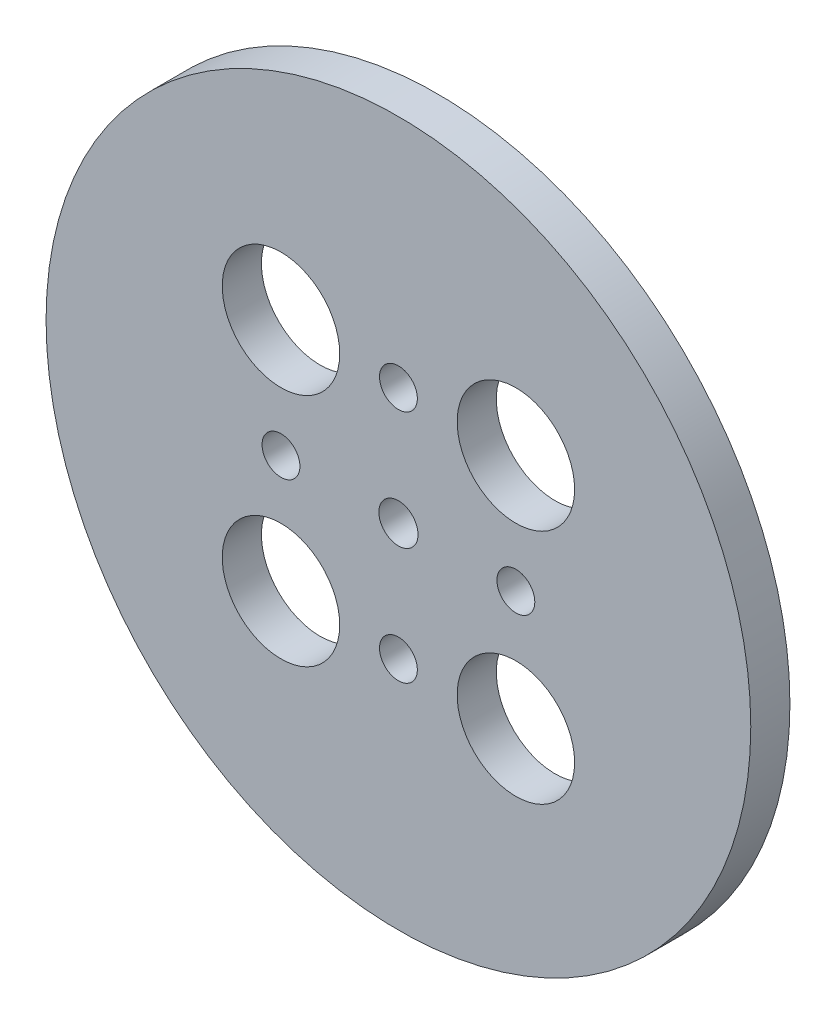
ISO-10303-21;
HEADER;
FILE_DESCRIPTION(('STEP AP214'),'2;1');
FILE_NAME('part.step','',(''),(''),'','','');
FILE_SCHEMA(('AUTOMOTIVE_DESIGN { 1 0 10303 214 1 1 1 1 }'));
ENDSEC;
DATA;
#1=APPLICATION_CONTEXT('core data for automotive mechanical design processes');
#2=APPLICATION_PROTOCOL_DEFINITION('international standard','automotive_design',2000,#1);
#3=PRODUCT_CONTEXT('',#1,'mechanical');
#4=PRODUCT('Part','Part','',(#3));
#5=PRODUCT_RELATED_PRODUCT_CATEGORY('part','',(#4));
#6=PRODUCT_DEFINITION_FORMATION('','',#4);
#7=PRODUCT_DEFINITION_CONTEXT('part definition',#1,'design');
#8=PRODUCT_DEFINITION('design','',#6,#7);
#9=PRODUCT_DEFINITION_SHAPE('','',#8);
#10=(LENGTH_UNIT() NAMED_UNIT(*) SI_UNIT(.MILLI.,.METRE.));
#11=(NAMED_UNIT(*) PLANE_ANGLE_UNIT() SI_UNIT($,.RADIAN.));
#12=(NAMED_UNIT(*) SI_UNIT($,.STERADIAN.) SOLID_ANGLE_UNIT());
#13=UNCERTAINTY_MEASURE_WITH_UNIT(LENGTH_MEASURE(1.E-05),#10,'distance_accuracy_value','');
#14=(GEOMETRIC_REPRESENTATION_CONTEXT(3) GLOBAL_UNCERTAINTY_ASSIGNED_CONTEXT((#13)) GLOBAL_UNIT_ASSIGNED_CONTEXT((#10,
#11,#12)) REPRESENTATION_CONTEXT('',''));
#15=CARTESIAN_POINT('',(0.,0.,0.));
#16=DIRECTION('',(0.,0.,1.));
#17=DIRECTION('',(1.,0.,0.));
#18=AXIS2_PLACEMENT_3D('',#15,#16,#17);
#19=CARTESIAN_POINT('',(215.7478079135,241.9520199932,3.));
#20=DIRECTION('',(0.,0.,1.));
#21=DIRECTION('',(1.,0.,0.));
#22=AXIS2_PLACEMENT_3D('',#19,#20,#21);
#23=PLANE('',#22);
#24=CARTESIAN_POINT('',(224.7478079135,241.9520199932,3.));
#25=DIRECTION('',(0.,0.,1.));
#26=DIRECTION('',(1.,0.,0.));
#27=AXIS2_PLACEMENT_3D('',#24,#25,#26);
#28=CIRCLE('',#27,1.45000000000001);
#29=CARTESIAN_POINT('',(226.1978079135,241.9520199932,3.));
#30=VERTEX_POINT('',#29);
#31=EDGE_CURVE('E83',#30,#30,#28,.T.);
#32=ORIENTED_EDGE('',*,*,#31,.F.);
#33=EDGE_LOOP('',(#32));
#34=FACE_BOUND('',#33,.T.);
#35=CARTESIAN_POINT('',(215.7478079135,232.9520199932,3.));
#36=DIRECTION('',(0.,0.,1.));
#37=DIRECTION('',(1.,0.,0.));
#38=AXIS2_PLACEMENT_3D('',#35,#36,#37);
#39=CIRCLE('',#38,1.45000000000001);
#40=CARTESIAN_POINT('',(217.1978079135,232.9520199932,3.));
#41=VERTEX_POINT('',#40);
#42=EDGE_CURVE('E71',#41,#41,#39,.T.);
#43=ORIENTED_EDGE('',*,*,#42,.F.);
#44=EDGE_LOOP('',(#43));
#45=FACE_BOUND('',#44,.T.);
#46=CARTESIAN_POINT('',(224.7478079135,250.9520199932,3.));
#47=DIRECTION('',(0.,0.,1.));
#48=DIRECTION('',(1.,0.,0.));
#49=AXIS2_PLACEMENT_3D('',#46,#47,#48);
#50=CIRCLE('',#49,4.5);
#51=CARTESIAN_POINT('',(229.2478079135,250.9520199932,3.));
#52=VERTEX_POINT('',#51);
#53=EDGE_CURVE('E59',#52,#52,#50,.T.);
#54=ORIENTED_EDGE('',*,*,#53,.F.);
#55=EDGE_LOOP('',(#54));
#56=FACE_BOUND('',#55,.T.);
#57=CARTESIAN_POINT('',(206.7478079135,232.9520199932,3.));
#58=DIRECTION('',(0.,0.,1.));
#59=DIRECTION('',(1.,0.,0.));
#60=AXIS2_PLACEMENT_3D('',#57,#58,#59);
#61=CIRCLE('',#60,4.5);
#62=CARTESIAN_POINT('',(211.2478079135,232.9520199932,3.));
#63=VERTEX_POINT('',#62);
#64=EDGE_CURVE('E47',#63,#63,#61,.T.);
#65=ORIENTED_EDGE('',*,*,#64,.F.);
#66=EDGE_LOOP('',(#65));
#67=FACE_BOUND('',#66,.T.);
#68=CARTESIAN_POINT('',(215.7478079135,241.9520199932,3.));
#69=DIRECTION('',(0.,0.,1.));
#70=DIRECTION('',(1.,0.,0.));
#71=AXIS2_PLACEMENT_3D('',#68,#69,#70);
#72=CIRCLE('',#71,27.);
#73=CARTESIAN_POINT('',(242.7478079135,241.9520199932,3.));
#74=VERTEX_POINT('',#73);
#75=EDGE_CURVE('E10',#74,#74,#72,.T.);
#76=ORIENTED_EDGE('',*,*,#75,.T.);
#77=EDGE_LOOP('',(#76));
#78=FACE_BOUND('',#77,.T.);
#79=CARTESIAN_POINT('',(206.7478079135,250.9520199932,3.));
#80=DIRECTION('',(0.,0.,1.));
#81=DIRECTION('',(1.,0.,0.));
#82=AXIS2_PLACEMENT_3D('',#79,#80,#81);
#83=CIRCLE('',#82,4.5);
#84=CARTESIAN_POINT('',(211.2478079135,250.9520199932,3.));
#85=VERTEX_POINT('',#84);
#86=EDGE_CURVE('E42',#85,#85,#83,.T.);
#87=ORIENTED_EDGE('',*,*,#86,.F.);
#88=EDGE_LOOP('',(#87));
#89=FACE_BOUND('',#88,.T.);
#90=CARTESIAN_POINT('',(224.7478079135,232.8274081957,3.));
#91=DIRECTION('',(0.,0.,1.));
#92=DIRECTION('',(1.,0.,0.));
#93=AXIS2_PLACEMENT_3D('',#90,#91,#92);
#94=CIRCLE('',#93,4.5);
#95=CARTESIAN_POINT('',(229.2478079135,232.8274081957,3.));
#96=VERTEX_POINT('',#95);
#97=EDGE_CURVE('E53',#96,#96,#94,.T.);
#98=ORIENTED_EDGE('',*,*,#97,.F.);
#99=EDGE_LOOP('',(#98));
#100=FACE_BOUND('',#99,.T.);
#101=CARTESIAN_POINT('',(215.7478079135,241.9520199932,3.));
#102=DIRECTION('',(0.,0.,1.));
#103=DIRECTION('',(1.,0.,0.));
#104=AXIS2_PLACEMENT_3D('',#101,#102,#103);
#105=CIRCLE('',#104,1.5);
#106=CARTESIAN_POINT('',(217.2478079135,241.9520199932,3.));
#107=VERTEX_POINT('',#106);
#108=EDGE_CURVE('E65',#107,#107,#105,.T.);
#109=ORIENTED_EDGE('',*,*,#108,.F.);
#110=EDGE_LOOP('',(#109));
#111=FACE_BOUND('',#110,.T.);
#112=CARTESIAN_POINT('',(215.7478079135,250.9520199932,3.));
#113=DIRECTION('',(0.,0.,1.));
#114=DIRECTION('',(1.,0.,0.));
#115=AXIS2_PLACEMENT_3D('',#112,#113,#114);
#116=CIRCLE('',#115,1.45000000000001);
#117=CARTESIAN_POINT('',(217.1978079135,250.9520199932,3.));
#118=VERTEX_POINT('',#117);
#119=EDGE_CURVE('E77',#118,#118,#116,.T.);
#120=ORIENTED_EDGE('',*,*,#119,.F.);
#121=EDGE_LOOP('',(#120));
#122=FACE_BOUND('',#121,.T.);
#123=CARTESIAN_POINT('',(206.7478079135,241.9520199932,3.));
#124=DIRECTION('',(0.,0.,1.));
#125=DIRECTION('',(1.,0.,0.));
#126=AXIS2_PLACEMENT_3D('',#123,#124,#125);
#127=CIRCLE('',#126,1.45000000000001);
#128=CARTESIAN_POINT('',(208.1978079135,241.9520199932,3.));
#129=VERTEX_POINT('',#128);
#130=EDGE_CURVE('E89',#129,#129,#127,.T.);
#131=ORIENTED_EDGE('',*,*,#130,.F.);
#132=EDGE_LOOP('',(#131));
#133=FACE_BOUND('',#132,.T.);
#134=ADVANCED_FACE('F31',(#34,#45,#56,#67,#78,#89,#100,#111,#122,#133),#23,.T.);
#135=CARTESIAN_POINT('',(215.7478079135,241.9520199932,0.));
#136=DIRECTION('',(0.,0.,1.));
#137=DIRECTION('',(1.,0.,0.));
#138=AXIS2_PLACEMENT_3D('',#135,#136,#137);
#139=PLANE('',#138);
#140=CARTESIAN_POINT('',(224.7478079135,241.9520199932,0.));
#141=DIRECTION('',(0.,0.,1.));
#142=DIRECTION('',(1.,0.,0.));
#143=AXIS2_PLACEMENT_3D('',#140,#141,#142);
#144=CIRCLE('',#143,1.45000000000001);
#145=CARTESIAN_POINT('',(226.1978079135,241.9520199932,0.));
#146=VERTEX_POINT('',#145);
#147=EDGE_CURVE('E86',#146,#146,#144,.T.);
#148=ORIENTED_EDGE('',*,*,#147,.T.);
#149=EDGE_LOOP('',(#148));
#150=FACE_BOUND('',#149,.T.);
#151=CARTESIAN_POINT('',(215.7478079135,232.9520199932,0.));
#152=DIRECTION('',(0.,0.,1.));
#153=DIRECTION('',(1.,0.,0.));
#154=AXIS2_PLACEMENT_3D('',#151,#152,#153);
#155=CIRCLE('',#154,1.45000000000001);
#156=CARTESIAN_POINT('',(217.1978079135,232.9520199932,0.));
#157=VERTEX_POINT('',#156);
#158=EDGE_CURVE('E74',#157,#157,#155,.T.);
#159=ORIENTED_EDGE('',*,*,#158,.T.);
#160=EDGE_LOOP('',(#159));
#161=FACE_BOUND('',#160,.T.);
#162=CARTESIAN_POINT('',(224.7478079135,250.9520199932,0.));
#163=DIRECTION('',(0.,0.,1.));
#164=DIRECTION('',(1.,0.,0.));
#165=AXIS2_PLACEMENT_3D('',#162,#163,#164);
#166=CIRCLE('',#165,4.5);
#167=CARTESIAN_POINT('',(229.2478079135,250.9520199932,0.));
#168=VERTEX_POINT('',#167);
#169=EDGE_CURVE('E62',#168,#168,#166,.T.);
#170=ORIENTED_EDGE('',*,*,#169,.T.);
#171=EDGE_LOOP('',(#170));
#172=FACE_BOUND('',#171,.T.);
#173=CARTESIAN_POINT('',(206.7478079135,232.9520199932,0.));
#174=DIRECTION('',(0.,0.,1.));
#175=DIRECTION('',(1.,0.,0.));
#176=AXIS2_PLACEMENT_3D('',#173,#174,#175);
#177=CIRCLE('',#176,4.5);
#178=CARTESIAN_POINT('',(211.2478079135,232.9520199932,0.));
#179=VERTEX_POINT('',#178);
#180=EDGE_CURVE('E50',#179,#179,#177,.T.);
#181=ORIENTED_EDGE('',*,*,#180,.T.);
#182=EDGE_LOOP('',(#181));
#183=FACE_BOUND('',#182,.T.);
#184=CARTESIAN_POINT('',(215.7478079135,241.9520199932,0.));
#185=DIRECTION('',(0.,0.,1.));
#186=DIRECTION('',(1.,0.,0.));
#187=AXIS2_PLACEMENT_3D('',#184,#185,#186);
#188=CIRCLE('',#187,27.);
#189=CARTESIAN_POINT('',(242.7478079135,241.9520199932,0.));
#190=VERTEX_POINT('',#189);
#191=EDGE_CURVE('E35',#190,#190,#188,.T.);
#192=ORIENTED_EDGE('',*,*,#191,.F.);
#193=EDGE_LOOP('',(#192));
#194=FACE_BOUND('',#193,.T.);
#195=CARTESIAN_POINT('',(206.7478079135,250.9520199932,0.));
#196=DIRECTION('',(0.,0.,1.));
#197=DIRECTION('',(1.,0.,0.));
#198=AXIS2_PLACEMENT_3D('',#195,#196,#197);
#199=CIRCLE('',#198,4.5);
#200=CARTESIAN_POINT('',(211.2478079135,250.9520199932,0.));
#201=VERTEX_POINT('',#200);
#202=EDGE_CURVE('E44',#201,#201,#199,.T.);
#203=ORIENTED_EDGE('',*,*,#202,.T.);
#204=EDGE_LOOP('',(#203));
#205=FACE_BOUND('',#204,.T.);
#206=CARTESIAN_POINT('',(224.7478079135,232.8274081957,0.));
#207=DIRECTION('',(0.,0.,1.));
#208=DIRECTION('',(1.,0.,0.));
#209=AXIS2_PLACEMENT_3D('',#206,#207,#208);
#210=CIRCLE('',#209,4.5);
#211=CARTESIAN_POINT('',(229.2478079135,232.8274081957,0.));
#212=VERTEX_POINT('',#211);
#213=EDGE_CURVE('E56',#212,#212,#210,.T.);
#214=ORIENTED_EDGE('',*,*,#213,.T.);
#215=EDGE_LOOP('',(#214));
#216=FACE_BOUND('',#215,.T.);
#217=CARTESIAN_POINT('',(215.7478079135,241.9520199932,0.));
#218=DIRECTION('',(0.,0.,1.));
#219=DIRECTION('',(1.,0.,0.));
#220=AXIS2_PLACEMENT_3D('',#217,#218,#219);
#221=CIRCLE('',#220,1.5);
#222=CARTESIAN_POINT('',(217.2478079135,241.9520199932,0.));
#223=VERTEX_POINT('',#222);
#224=EDGE_CURVE('E68',#223,#223,#221,.T.);
#225=ORIENTED_EDGE('',*,*,#224,.T.);
#226=EDGE_LOOP('',(#225));
#227=FACE_BOUND('',#226,.T.);
#228=CARTESIAN_POINT('',(215.7478079135,250.9520199932,0.));
#229=DIRECTION('',(0.,0.,1.));
#230=DIRECTION('',(1.,0.,0.));
#231=AXIS2_PLACEMENT_3D('',#228,#229,#230);
#232=CIRCLE('',#231,1.45000000000001);
#233=CARTESIAN_POINT('',(217.1978079135,250.9520199932,0.));
#234=VERTEX_POINT('',#233);
#235=EDGE_CURVE('E80',#234,#234,#232,.T.);
#236=ORIENTED_EDGE('',*,*,#235,.T.);
#237=EDGE_LOOP('',(#236));
#238=FACE_BOUND('',#237,.T.);
#239=CARTESIAN_POINT('',(206.7478079135,241.9520199932,0.));
#240=DIRECTION('',(0.,0.,1.));
#241=DIRECTION('',(1.,0.,0.));
#242=AXIS2_PLACEMENT_3D('',#239,#240,#241);
#243=CIRCLE('',#242,1.45000000000001);
#244=CARTESIAN_POINT('',(208.1978079135,241.9520199932,0.));
#245=VERTEX_POINT('',#244);
#246=EDGE_CURVE('E92',#245,#245,#243,.T.);
#247=ORIENTED_EDGE('',*,*,#246,.T.);
#248=EDGE_LOOP('',(#247));
#249=FACE_BOUND('',#248,.T.);
#250=ADVANCED_FACE('F102',(#150,#161,#172,#183,#194,#205,#216,#227,#238,#249),#139,.F.);
#251=CARTESIAN_POINT('',(215.7478079135,241.9520199932,3.));
#252=DIRECTION('',(0.,0.,-1.));
#253=DIRECTION('',(-1.,0.,0.));
#254=AXIS2_PLACEMENT_3D('',#251,#252,#253);
#255=CYLINDRICAL_SURFACE('',#254,27.);
#256=ORIENTED_EDGE('',*,*,#75,.F.);
#257=EDGE_LOOP('',(#256));
#258=FACE_BOUND('',#257,.T.);
#259=ORIENTED_EDGE('',*,*,#191,.T.);
#260=EDGE_LOOP('',(#259));
#261=FACE_BOUND('',#260,.T.);
#262=ADVANCED_FACE('F33',(#258,#261),#255,.T.);
#263=CARTESIAN_POINT('',(206.7478079135,250.9520199932,3.));
#264=DIRECTION('',(0.,0.,-1.));
#265=DIRECTION('',(-1.,0.,0.));
#266=AXIS2_PLACEMENT_3D('',#263,#264,#265);
#267=CYLINDRICAL_SURFACE('',#266,4.5);
#268=ORIENTED_EDGE('',*,*,#86,.T.);
#269=EDGE_LOOP('',(#268));
#270=FACE_BOUND('',#269,.T.);
#271=ORIENTED_EDGE('',*,*,#202,.F.);
#272=EDGE_LOOP('',(#271));
#273=FACE_BOUND('',#272,.T.);
#274=ADVANCED_FACE('F112',(#270,#273),#267,.F.);
#275=CARTESIAN_POINT('',(206.7478079135,232.9520199932,3.));
#276=DIRECTION('',(0.,0.,-1.));
#277=DIRECTION('',(-1.,0.,0.));
#278=AXIS2_PLACEMENT_3D('',#275,#276,#277);
#279=CYLINDRICAL_SURFACE('',#278,4.5);
#280=ORIENTED_EDGE('',*,*,#64,.T.);
#281=EDGE_LOOP('',(#280));
#282=FACE_BOUND('',#281,.T.);
#283=ORIENTED_EDGE('',*,*,#180,.F.);
#284=EDGE_LOOP('',(#283));
#285=FACE_BOUND('',#284,.T.);
#286=ADVANCED_FACE('F115',(#282,#285),#279,.F.);
#287=CARTESIAN_POINT('',(224.7478079135,232.8274081957,3.));
#288=DIRECTION('',(0.,0.,-1.));
#289=DIRECTION('',(-1.,0.,0.));
#290=AXIS2_PLACEMENT_3D('',#287,#288,#289);
#291=CYLINDRICAL_SURFACE('',#290,4.5);
#292=ORIENTED_EDGE('',*,*,#97,.T.);
#293=EDGE_LOOP('',(#292));
#294=FACE_BOUND('',#293,.T.);
#295=ORIENTED_EDGE('',*,*,#213,.F.);
#296=EDGE_LOOP('',(#295));
#297=FACE_BOUND('',#296,.T.);
#298=ADVANCED_FACE('F119',(#294,#297),#291,.F.);
#299=CARTESIAN_POINT('',(224.7478079135,250.9520199932,3.));
#300=DIRECTION('',(0.,0.,-1.));
#301=DIRECTION('',(-1.,0.,0.));
#302=AXIS2_PLACEMENT_3D('',#299,#300,#301);
#303=CYLINDRICAL_SURFACE('',#302,4.5);
#304=ORIENTED_EDGE('',*,*,#53,.T.);
#305=EDGE_LOOP('',(#304));
#306=FACE_BOUND('',#305,.T.);
#307=ORIENTED_EDGE('',*,*,#169,.F.);
#308=EDGE_LOOP('',(#307));
#309=FACE_BOUND('',#308,.T.);
#310=ADVANCED_FACE('F123',(#306,#309),#303,.F.);
#311=CARTESIAN_POINT('',(215.7478079135,241.9520199932,3.));
#312=DIRECTION('',(0.,0.,-1.));
#313=DIRECTION('',(-1.,0.,0.));
#314=AXIS2_PLACEMENT_3D('',#311,#312,#313);
#315=CYLINDRICAL_SURFACE('',#314,1.5);
#316=ORIENTED_EDGE('',*,*,#108,.T.);
#317=EDGE_LOOP('',(#316));
#318=FACE_BOUND('',#317,.T.);
#319=ORIENTED_EDGE('',*,*,#224,.F.);
#320=EDGE_LOOP('',(#319));
#321=FACE_BOUND('',#320,.T.);
#322=ADVANCED_FACE('F127',(#318,#321),#315,.F.);
#323=CARTESIAN_POINT('',(215.7478079135,232.9520199932,3.));
#324=DIRECTION('',(0.,0.,-1.));
#325=DIRECTION('',(-1.,0.,0.));
#326=AXIS2_PLACEMENT_3D('',#323,#324,#325);
#327=CYLINDRICAL_SURFACE('',#326,1.45000000000001);
#328=ORIENTED_EDGE('',*,*,#42,.T.);
#329=EDGE_LOOP('',(#328));
#330=FACE_BOUND('',#329,.T.);
#331=ORIENTED_EDGE('',*,*,#158,.F.);
#332=EDGE_LOOP('',(#331));
#333=FACE_BOUND('',#332,.T.);
#334=ADVANCED_FACE('F131',(#330,#333),#327,.F.);
#335=CARTESIAN_POINT('',(215.7478079135,250.9520199932,3.));
#336=DIRECTION('',(0.,0.,-1.));
#337=DIRECTION('',(-1.,0.,0.));
#338=AXIS2_PLACEMENT_3D('',#335,#336,#337);
#339=CYLINDRICAL_SURFACE('',#338,1.45000000000001);
#340=ORIENTED_EDGE('',*,*,#119,.T.);
#341=EDGE_LOOP('',(#340));
#342=FACE_BOUND('',#341,.T.);
#343=ORIENTED_EDGE('',*,*,#235,.F.);
#344=EDGE_LOOP('',(#343));
#345=FACE_BOUND('',#344,.T.);
#346=ADVANCED_FACE('F135',(#342,#345),#339,.F.);
#347=CARTESIAN_POINT('',(224.7478079135,241.9520199932,3.));
#348=DIRECTION('',(0.,0.,-1.));
#349=DIRECTION('',(-1.,0.,0.));
#350=AXIS2_PLACEMENT_3D('',#347,#348,#349);
#351=CYLINDRICAL_SURFACE('',#350,1.45000000000001);
#352=ORIENTED_EDGE('',*,*,#31,.T.);
#353=EDGE_LOOP('',(#352));
#354=FACE_BOUND('',#353,.T.);
#355=ORIENTED_EDGE('',*,*,#147,.F.);
#356=EDGE_LOOP('',(#355));
#357=FACE_BOUND('',#356,.T.);
#358=ADVANCED_FACE('F139',(#354,#357),#351,.F.);
#359=CARTESIAN_POINT('',(206.7478079135,241.9520199932,3.));
#360=DIRECTION('',(0.,0.,-1.));
#361=DIRECTION('',(-1.,0.,0.));
#362=AXIS2_PLACEMENT_3D('',#359,#360,#361);
#363=CYLINDRICAL_SURFACE('',#362,1.45000000000001);
#364=ORIENTED_EDGE('',*,*,#130,.T.);
#365=EDGE_LOOP('',(#364));
#366=FACE_BOUND('',#365,.T.);
#367=ORIENTED_EDGE('',*,*,#246,.F.);
#368=EDGE_LOOP('',(#367));
#369=FACE_BOUND('',#368,.T.);
#370=ADVANCED_FACE('F98',(#366,#369),#363,.F.);
#371=CLOSED_SHELL('',(#134,#250,#262,#274,#286,#298,#310,#322,#334,#346,#358,#370));
#372=MANIFOLD_SOLID_BREP('B2',#371);
#373=ADVANCED_BREP_SHAPE_REPRESENTATION('',(#18,#372),#14);
#374=SHAPE_DEFINITION_REPRESENTATION(#9,#373);
ENDSEC;
END-ISO-10303-21;
